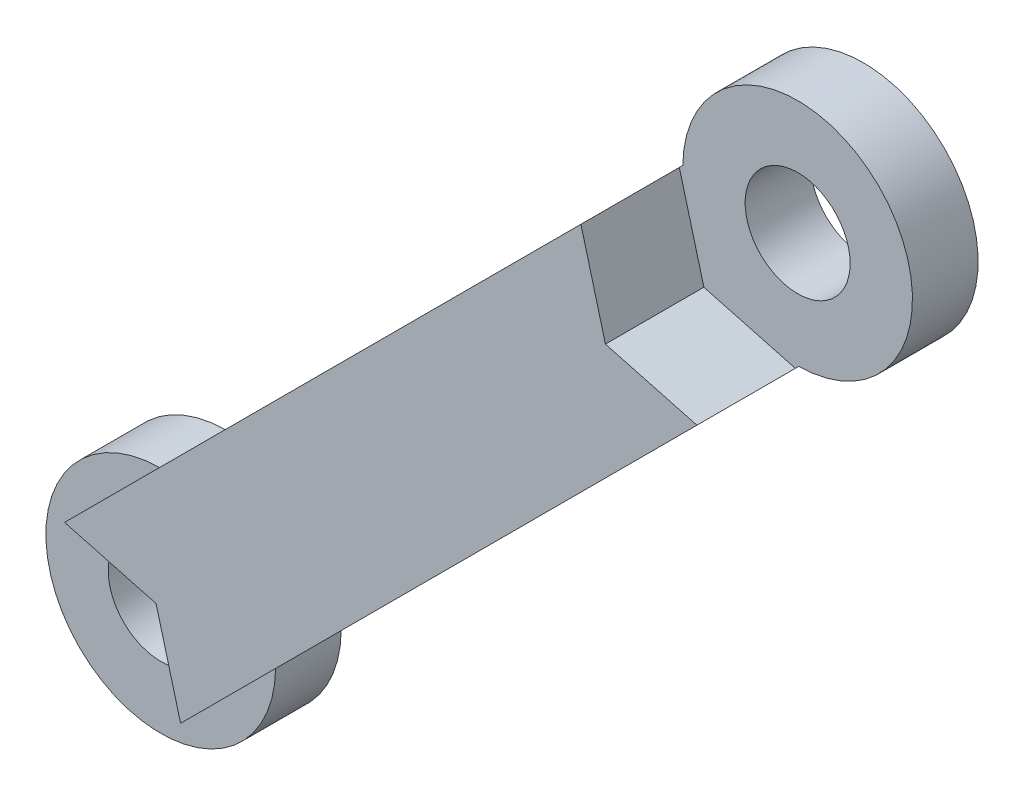
ISO-10303-21;
HEADER;
FILE_DESCRIPTION(('STEP AP214'),'2;1');
FILE_NAME('part.step','',(''),(''),'','','');
FILE_SCHEMA(('AUTOMOTIVE_DESIGN { 1 0 10303 214 1 1 1 1 }'));
ENDSEC;
DATA;
#1=APPLICATION_CONTEXT('core data for automotive mechanical design processes');
#2=APPLICATION_PROTOCOL_DEFINITION('international standard','automotive_design',2000,#1);
#3=PRODUCT_CONTEXT('',#1,'mechanical');
#4=PRODUCT('Part','Part','',(#3));
#5=PRODUCT_RELATED_PRODUCT_CATEGORY('part','',(#4));
#6=PRODUCT_DEFINITION_FORMATION('','',#4);
#7=PRODUCT_DEFINITION_CONTEXT('part definition',#1,'design');
#8=PRODUCT_DEFINITION('design','',#6,#7);
#9=PRODUCT_DEFINITION_SHAPE('','',#8);
#10=(LENGTH_UNIT() NAMED_UNIT(*) SI_UNIT(.MILLI.,.METRE.));
#11=(NAMED_UNIT(*) PLANE_ANGLE_UNIT() SI_UNIT($,.RADIAN.));
#12=(NAMED_UNIT(*) SI_UNIT($,.STERADIAN.) SOLID_ANGLE_UNIT());
#13=UNCERTAINTY_MEASURE_WITH_UNIT(LENGTH_MEASURE(1.E-05),#10,'distance_accuracy_value','');
#14=(GEOMETRIC_REPRESENTATION_CONTEXT(3) GLOBAL_UNCERTAINTY_ASSIGNED_CONTEXT((#13)) GLOBAL_UNIT_ASSIGNED_CONTEXT((#10,
#11,#12)) REPRESENTATION_CONTEXT('',''));
#15=CARTESIAN_POINT('',(0.,0.,0.));
#16=DIRECTION('',(0.,0.,1.));
#17=DIRECTION('',(1.,0.,0.));
#18=AXIS2_PLACEMENT_3D('',#15,#16,#17);
#19=CARTESIAN_POINT('',(12.0208152801712,12.0208152801714,5.));
#20=DIRECTION('',(0.,0.,-1.));
#21=DIRECTION('',(-1.,0.,0.));
#22=AXIS2_PLACEMENT_3D('',#19,#20,#21);
#23=CYLINDRICAL_SURFACE('',#22,3.5);
#24=CARTESIAN_POINT('',(12.0208152801712,12.0208152801714,2.));
#25=DIRECTION('',(0.,0.,1.));
#26=DIRECTION('',(1.,0.,0.));
#27=AXIS2_PLACEMENT_3D('',#24,#25,#26);
#28=CIRCLE('',#27,3.5);
#29=CARTESIAN_POINT('',(11.9850991347737,15.5206330407067,2.));
#30=VERTEX_POINT('',#29);
#31=CARTESIAN_POINT('',(15.5206330407065,11.9850991347739,2.));
#32=VERTEX_POINT('',#31);
#33=EDGE_CURVE('E145',#30,#32,#28,.T.);
#34=ORIENTED_EDGE('',*,*,#33,.F.);
#35=DIRECTION('',(0.,0.,-1.));
#36=VECTOR('',#35,1.);
#37=CARTESIAN_POINT('',(11.9850991347737,15.5206330407067,5.));
#38=LINE('',#37,#36);
#39=CARTESIAN_POINT('',(11.9850991347737,15.5206330407067,0.));
#40=VERTEX_POINT('',#39);
#41=EDGE_CURVE('E182',#30,#40,#38,.T.);
#42=ORIENTED_EDGE('',*,*,#41,.T.);
#43=CARTESIAN_POINT('',(12.0208152801712,12.0208152801714,0.));
#44=DIRECTION('',(0.,0.,1.));
#45=DIRECTION('',(1.,0.,0.));
#46=AXIS2_PLACEMENT_3D('',#43,#44,#45);
#47=CIRCLE('',#46,3.5);
#48=CARTESIAN_POINT('',(15.5206330407064,11.9850991347739,0.));
#49=VERTEX_POINT('',#48);
#50=EDGE_CURVE('E185',#40,#49,#47,.T.);
#51=ORIENTED_EDGE('',*,*,#50,.T.);
#52=DIRECTION('',(0.,0.,-1.));
#53=VECTOR('',#52,1.);
#54=CARTESIAN_POINT('',(15.5206330407064,11.9850991347739,5.));
#55=LINE('',#54,#53);
#56=EDGE_CURVE('E50',#32,#49,#55,.T.);
#57=ORIENTED_EDGE('',*,*,#56,.F.);
#58=EDGE_LOOP('',(#34,#42,#51,#57));
#59=FACE_BOUND('',#58,.T.);
#60=ADVANCED_FACE('F41',(#59),#23,.T.);
#61=CARTESIAN_POINT('',(31.4305356174037,31.430535617404,5.));
#62=DIRECTION('',(0.,0.,-1.));
#63=DIRECTION('',(-1.,0.,0.));
#64=AXIS2_PLACEMENT_3D('',#61,#62,#63);
#65=CYLINDRICAL_SURFACE('',#64,3.5);
#66=DIRECTION('',(0.,0.,-1.));
#67=VECTOR('',#66,1.);
#68=CARTESIAN_POINT('',(27.9307178568685,31.4662517628015,5.));
#69=LINE('',#68,#67);
#70=CARTESIAN_POINT('',(27.9307178568685,31.4662517628015,2.));
#71=VERTEX_POINT('',#70);
#72=CARTESIAN_POINT('',(27.9307178568685,31.4662517628015,0.));
#73=VERTEX_POINT('',#72);
#74=EDGE_CURVE('E200',#71,#73,#69,.T.);
#75=ORIENTED_EDGE('',*,*,#74,.F.);
#76=CARTESIAN_POINT('',(31.4305356174037,31.430535617404,2.));
#77=DIRECTION('',(0.,0.,1.));
#78=DIRECTION('',(1.,0.,0.));
#79=AXIS2_PLACEMENT_3D('',#76,#77,#78);
#80=CIRCLE('',#79,3.5);
#81=CARTESIAN_POINT('',(31.4662517628012,27.9307178568688,2.));
#82=VERTEX_POINT('',#81);
#83=EDGE_CURVE('E168',#71,#82,#80,.F.);
#84=ORIENTED_EDGE('',*,*,#83,.T.);
#85=DIRECTION('',(0.,0.,-1.));
#86=VECTOR('',#85,1.);
#87=CARTESIAN_POINT('',(31.4662517628012,27.9307178568688,5.));
#88=LINE('',#87,#86);
#89=CARTESIAN_POINT('',(31.4662517628012,27.9307178568688,0.));
#90=VERTEX_POINT('',#89);
#91=EDGE_CURVE('E202',#82,#90,#88,.T.);
#92=ORIENTED_EDGE('',*,*,#91,.T.);
#93=CARTESIAN_POINT('',(31.4305356174037,31.430535617404,0.));
#94=DIRECTION('',(0.,0.,1.));
#95=DIRECTION('',(1.,0.,0.));
#96=AXIS2_PLACEMENT_3D('',#93,#94,#95);
#97=CIRCLE('',#96,3.5);
#98=EDGE_CURVE('E191',#73,#90,#97,.F.);
#99=ORIENTED_EDGE('',*,*,#98,.F.);
#100=EDGE_LOOP('',(#75,#84,#92,#99));
#101=FACE_BOUND('',#100,.T.);
#102=ADVANCED_FACE('F220',(#101),#65,.T.);
#103=CARTESIAN_POINT('',(12.0208152801712,12.0208152801714,5.));
#104=DIRECTION('',(0.,0.,-1.));
#105=DIRECTION('',(-1.,0.,0.));
#106=AXIS2_PLACEMENT_3D('',#103,#104,#105);
#107=CYLINDRICAL_SURFACE('',#106,1.6);
#108=CARTESIAN_POINT('',(12.0208152801712,12.0208152801714,0.));
#109=DIRECTION('',(0.,0.,1.));
#110=DIRECTION('',(1.,0.,0.));
#111=AXIS2_PLACEMENT_3D('',#108,#109,#110);
#112=CIRCLE('',#111,1.6);
#113=CARTESIAN_POINT('',(13.6208152801712,12.0208152801714,0.));
#114=VERTEX_POINT('',#113);
#115=EDGE_CURVE('E174',#114,#114,#112,.T.);
#116=ORIENTED_EDGE('',*,*,#115,.F.);
#117=EDGE_LOOP('',(#116));
#118=FACE_BOUND('',#117,.T.);
#119=CARTESIAN_POINT('',(12.0208152801712,12.0208152801714,2.));
#120=DIRECTION('',(0.,0.,1.));
#121=DIRECTION('',(1.,0.,0.));
#122=AXIS2_PLACEMENT_3D('',#119,#120,#121);
#123=CIRCLE('',#122,1.6);
#124=CARTESIAN_POINT('',(13.6208152801712,12.0208152801714,2.));
#125=VERTEX_POINT('',#124);
#126=EDGE_CURVE('E138',#125,#125,#123,.F.);
#127=ORIENTED_EDGE('',*,*,#126,.F.);
#128=EDGE_LOOP('',(#127));
#129=FACE_BOUND('',#128,.T.);
#130=ADVANCED_FACE('F43',(#118,#129),#107,.F.);
#131=CARTESIAN_POINT('',(31.4305356174037,31.430535617404,5.));
#132=DIRECTION('',(0.,0.,-1.));
#133=DIRECTION('',(-1.,0.,0.));
#134=AXIS2_PLACEMENT_3D('',#131,#132,#133);
#135=CYLINDRICAL_SURFACE('',#134,1.6);
#136=CARTESIAN_POINT('',(31.4305356174037,31.430535617404,0.));
#137=DIRECTION('',(0.,0.,1.));
#138=DIRECTION('',(1.,0.,0.));
#139=AXIS2_PLACEMENT_3D('',#136,#137,#138);
#140=CIRCLE('',#139,1.6);
#141=CARTESIAN_POINT('',(33.0305356174037,31.430535617404,0.));
#142=VERTEX_POINT('',#141);
#143=EDGE_CURVE('E179',#142,#142,#140,.F.);
#144=ORIENTED_EDGE('',*,*,#143,.T.);
#145=EDGE_LOOP('',(#144));
#146=FACE_BOUND('',#145,.T.);
#147=CARTESIAN_POINT('',(31.4305356174037,31.430535617404,2.));
#148=DIRECTION('',(0.,0.,1.));
#149=DIRECTION('',(1.,0.,0.));
#150=AXIS2_PLACEMENT_3D('',#147,#148,#149);
#151=CIRCLE('',#150,1.6);
#152=CARTESIAN_POINT('',(33.0305356174037,31.430535617404,2.));
#153=VERTEX_POINT('',#152);
#154=EDGE_CURVE('E45',#153,#153,#151,.F.);
#155=ORIENTED_EDGE('',*,*,#154,.F.);
#156=EDGE_LOOP('',(#155));
#157=FACE_BOUND('',#156,.T.);
#158=ADVANCED_FACE('F254',(#146,#157),#135,.F.);
#159=CARTESIAN_POINT('',(1.76776695296628,-1.76776695296627,5.));
#160=DIRECTION('',(0.707106781186549,-0.707106781186546,0.));
#161=DIRECTION('',(0.707106781186546,0.707106781186549,0.));
#162=AXIS2_PLACEMENT_3D('',#159,#160,#161);
#163=PLANE('',#162);
#164=DIRECTION('',(0.,0.,1.));
#165=VECTOR('',#164,1.);
#166=CARTESIAN_POINT('',(15.6256995402249,12.0901656342924,2.));
#167=LINE('',#166,#165);
#168=CARTESIAN_POINT('',(15.6256995402249,12.0901656342924,2.));
#169=VERTEX_POINT('',#168);
#170=CARTESIAN_POINT('',(15.6256995402249,12.0901656342924,5.));
#171=VERTEX_POINT('',#170);
#172=EDGE_CURVE('E151',#169,#171,#167,.T.);
#173=ORIENTED_EDGE('',*,*,#172,.F.);
#174=DIRECTION('',(0.707106781186546,0.707106781186549,0.));
#175=VECTOR('',#174,1.);
#176=CARTESIAN_POINT('',(1.76776695296628,-1.76776695296627,2.));
#177=LINE('',#176,#175);
#178=EDGE_CURVE('E125',#32,#169,#177,.T.);
#179=ORIENTED_EDGE('',*,*,#178,.F.);
#180=ORIENTED_EDGE('',*,*,#56,.T.);
#181=DIRECTION('',(-0.707106781186546,-0.707106781186549,0.));
#182=VECTOR('',#181,1.);
#183=CARTESIAN_POINT('',(1.76776695296628,-1.76776695296627,0.));
#184=LINE('',#183,#182);
#185=EDGE_CURVE('E188',#90,#49,#184,.T.);
#186=ORIENTED_EDGE('',*,*,#185,.F.);
#187=ORIENTED_EDGE('',*,*,#91,.F.);
#188=DIRECTION('',(-0.707106781186546,-0.707106781186549,0.));
#189=VECTOR('',#188,1.);
#190=CARTESIAN_POINT('',(1.76776695296628,-1.76776695296627,2.));
#191=LINE('',#190,#189);
#192=CARTESIAN_POINT('',(31.3611852632827,27.8256513573503,2.));
#193=VERTEX_POINT('',#192);
#194=EDGE_CURVE('E171',#82,#193,#191,.T.);
#195=ORIENTED_EDGE('',*,*,#194,.T.);
#196=DIRECTION('',(0.,0.,-1.));
#197=VECTOR('',#196,1.);
#198=CARTESIAN_POINT('',(31.3611852632827,27.8256513573503,5.));
#199=LINE('',#198,#197);
#200=CARTESIAN_POINT('',(31.3611852632827,27.8256513573503,5.));
#201=VERTEX_POINT('',#200);
#202=EDGE_CURVE('E164',#201,#193,#199,.T.);
#203=ORIENTED_EDGE('',*,*,#202,.F.);
#204=DIRECTION('',(-0.707106781186546,-0.707106781186549,0.));
#205=VECTOR('',#204,1.);
#206=CARTESIAN_POINT('',(1.76776695296628,-1.76776695296627,5.));
#207=LINE('',#206,#205);
#208=EDGE_CURVE('E175',#201,#171,#207,.T.);
#209=ORIENTED_EDGE('',*,*,#208,.T.);
#210=EDGE_LOOP('',(#173,#179,#180,#186,#187,#195,#203,#209));
#211=FACE_BOUND('',#210,.T.);
#212=ADVANCED_FACE('F207',(#211),#163,.T.);
#213=CARTESIAN_POINT('',(-1.76776695296645,1.76776695296645,5.));
#214=DIRECTION('',(0.707106781186549,-0.707106781186546,0.));
#215=DIRECTION('',(0.707106781186546,0.707106781186549,0.));
#216=AXIS2_PLACEMENT_3D('',#213,#214,#215);
#217=PLANE('',#216);
#218=DIRECTION('',(-0.707106781186546,-0.707106781186549,0.));
#219=VECTOR('',#218,1.);
#220=CARTESIAN_POINT('',(-1.76776695296645,1.76776695296645,2.));
#221=LINE('',#220,#219);
#222=CARTESIAN_POINT('',(12.0901656342922,15.6256995402252,2.));
#223=VERTEX_POINT('',#222);
#224=EDGE_CURVE('E133',#223,#30,#221,.T.);
#225=ORIENTED_EDGE('',*,*,#224,.F.);
#226=DIRECTION('',(0.,0.,1.));
#227=VECTOR('',#226,1.);
#228=CARTESIAN_POINT('',(12.0901656342922,15.6256995402252,2.));
#229=LINE('',#228,#227);
#230=CARTESIAN_POINT('',(12.0901656342922,15.6256995402252,5.));
#231=VERTEX_POINT('',#230);
#232=EDGE_CURVE('E124',#223,#231,#229,.T.);
#233=ORIENTED_EDGE('',*,*,#232,.T.);
#234=DIRECTION('',(-0.707106781186546,-0.707106781186549,0.));
#235=VECTOR('',#234,1.);
#236=CARTESIAN_POINT('',(-1.76776695296645,1.76776695296645,5.));
#237=LINE('',#236,#235);
#238=CARTESIAN_POINT('',(27.82565135735,31.361185263283,5.));
#239=VERTEX_POINT('',#238);
#240=EDGE_CURVE('E178',#239,#231,#237,.T.);
#241=ORIENTED_EDGE('',*,*,#240,.F.);
#242=DIRECTION('',(0.,0.,-1.));
#243=VECTOR('',#242,1.);
#244=CARTESIAN_POINT('',(27.82565135735,31.361185263283,5.));
#245=LINE('',#244,#243);
#246=CARTESIAN_POINT('',(27.82565135735,31.361185263283,2.));
#247=VERTEX_POINT('',#246);
#248=EDGE_CURVE('E64',#239,#247,#245,.T.);
#249=ORIENTED_EDGE('',*,*,#248,.T.);
#250=DIRECTION('',(-0.707106781186546,-0.707106781186549,0.));
#251=VECTOR('',#250,1.);
#252=CARTESIAN_POINT('',(-1.76776695296645,1.76776695296645,2.));
#253=LINE('',#252,#251);
#254=EDGE_CURVE('E166',#71,#247,#253,.T.);
#255=ORIENTED_EDGE('',*,*,#254,.F.);
#256=ORIENTED_EDGE('',*,*,#74,.T.);
#257=DIRECTION('',(-0.707106781186546,-0.707106781186549,0.));
#258=VECTOR('',#257,1.);
#259=CARTESIAN_POINT('',(-1.76776695296645,1.76776695296645,0.));
#260=LINE('',#259,#258);
#261=EDGE_CURVE('E194',#73,#40,#260,.T.);
#262=ORIENTED_EDGE('',*,*,#261,.T.);
#263=ORIENTED_EDGE('',*,*,#41,.F.);
#264=EDGE_LOOP('',(#225,#233,#241,#249,#255,#256,#262,#263));
#265=FACE_BOUND('',#264,.T.);
#266=ADVANCED_FACE('F236',(#265),#217,.F.);
#267=CARTESIAN_POINT('',(0.,0.,5.));
#268=DIRECTION('',(0.,0.,1.));
#269=DIRECTION('',(1.,0.,0.));
#270=AXIS2_PLACEMENT_3D('',#267,#268,#269);
#271=PLANE('',#270);
#272=DIRECTION('',(-0.258819045102521,0.965925826289068,0.));
#273=VECTOR('',#272,1.);
#274=CARTESIAN_POINT('',(17.6015175555544,4.71631241457303,5.));
#275=LINE('',#274,#273);
#276=CARTESIAN_POINT('',(14.8785533134182,14.8785533134184,5.));
#277=VERTEX_POINT('',#276);
#278=EDGE_CURVE('E57',#171,#277,#275,.T.);
#279=ORIENTED_EDGE('',*,*,#278,.F.);
#280=ORIENTED_EDGE('',*,*,#208,.F.);
#281=DIRECTION('',(0.965925826289071,-0.258819045102513,0.));
#282=VECTOR('',#281,1.);
#283=CARTESIAN_POINT('',(28.5727975841567,28.572797584157,5.));
#284=LINE('',#283,#282);
#285=CARTESIAN_POINT('',(28.5727975841567,28.572797584157,5.));
#286=VERTEX_POINT('',#285);
#287=EDGE_CURVE('E149',#286,#201,#284,.T.);
#288=ORIENTED_EDGE('',*,*,#287,.F.);
#289=DIRECTION('',(0.258819045102525,-0.965925826289067,0.));
#290=VECTOR('',#289,1.);
#291=CARTESIAN_POINT('',(33.8019824706528,9.05721390558255,5.));
#292=LINE('',#291,#290);
#293=EDGE_CURVE('E11',#239,#286,#292,.T.);
#294=ORIENTED_EDGE('',*,*,#293,.F.);
#295=ORIENTED_EDGE('',*,*,#240,.T.);
#296=DIRECTION('',(-0.965925826289068,0.258819045102521,0.));
#297=VECTOR('',#296,1.);
#298=CARTESIAN_POINT('',(4.71631241457307,17.6015175555545,5.));
#299=LINE('',#298,#297);
#300=EDGE_CURVE('E141',#277,#231,#299,.T.);
#301=ORIENTED_EDGE('',*,*,#300,.F.);
#302=EDGE_LOOP('',(#279,#280,#288,#294,#295,#301));
#303=FACE_BOUND('',#302,.T.);
#304=ADVANCED_FACE('F233',(#303),#271,.T.);
#305=CARTESIAN_POINT('',(0.,0.,0.));
#306=DIRECTION('',(0.,0.,1.));
#307=DIRECTION('',(1.,0.,0.));
#308=AXIS2_PLACEMENT_3D('',#305,#306,#307);
#309=PLANE('',#308);
#310=ORIENTED_EDGE('',*,*,#115,.T.);
#311=EDGE_LOOP('',(#310));
#312=FACE_BOUND('',#311,.T.);
#313=ORIENTED_EDGE('',*,*,#50,.F.);
#314=ORIENTED_EDGE('',*,*,#261,.F.);
#315=ORIENTED_EDGE('',*,*,#98,.T.);
#316=ORIENTED_EDGE('',*,*,#185,.T.);
#317=EDGE_LOOP('',(#313,#314,#315,#316));
#318=FACE_BOUND('',#317,.T.);
#319=ORIENTED_EDGE('',*,*,#143,.F.);
#320=EDGE_LOOP('',(#319));
#321=FACE_BOUND('',#320,.T.);
#322=ADVANCED_FACE('F215',(#312,#318,#321),#309,.F.);
#323=CARTESIAN_POINT('',(0.,0.,2.));
#324=DIRECTION('',(0.,0.,1.));
#325=DIRECTION('',(1.,0.,0.));
#326=AXIS2_PLACEMENT_3D('',#323,#324,#325);
#327=PLANE('',#326);
#328=ORIENTED_EDGE('',*,*,#83,.F.);
#329=ORIENTED_EDGE('',*,*,#254,.T.);
#330=DIRECTION('',(0.258819045102525,-0.965925826289067,0.));
#331=VECTOR('',#330,1.);
#332=CARTESIAN_POINT('',(27.5267928666273,32.4765403349334,2.));
#333=LINE('',#332,#331);
#334=CARTESIAN_POINT('',(28.5727975841567,28.572797584157,2.));
#335=VERTEX_POINT('',#334);
#336=EDGE_CURVE('E157',#247,#335,#333,.T.);
#337=ORIENTED_EDGE('',*,*,#336,.T.);
#338=DIRECTION('',(0.965925826289071,-0.258819045102513,0.));
#339=VECTOR('',#338,1.);
#340=CARTESIAN_POINT('',(28.5727975841567,28.572797584157,2.));
#341=LINE('',#340,#339);
#342=EDGE_CURVE('E159',#335,#193,#341,.T.);
#343=ORIENTED_EDGE('',*,*,#342,.T.);
#344=ORIENTED_EDGE('',*,*,#194,.F.);
#345=EDGE_LOOP('',(#328,#329,#337,#343,#344));
#346=FACE_BOUND('',#345,.T.);
#347=ORIENTED_EDGE('',*,*,#154,.T.);
#348=EDGE_LOOP('',(#347));
#349=FACE_BOUND('',#348,.T.);
#350=ADVANCED_FACE('F224',(#346,#349),#327,.T.);
#351=CARTESIAN_POINT('',(27.5267928666273,32.4765403349334,2.));
#352=DIRECTION('',(-0.965925826289067,-0.258819045102525,0.));
#353=DIRECTION('',(0.258819045102525,-0.965925826289067,0.));
#354=AXIS2_PLACEMENT_3D('',#351,#352,#353);
#355=PLANE('',#354);
#356=ORIENTED_EDGE('',*,*,#293,.T.);
#357=DIRECTION('',(0.,0.,1.));
#358=VECTOR('',#357,1.);
#359=CARTESIAN_POINT('',(28.5727975841567,28.572797584157,2.));
#360=LINE('',#359,#358);
#361=EDGE_CURVE('E154',#335,#286,#360,.T.);
#362=ORIENTED_EDGE('',*,*,#361,.F.);
#363=ORIENTED_EDGE('',*,*,#336,.F.);
#364=ORIENTED_EDGE('',*,*,#248,.F.);
#365=EDGE_LOOP('',(#356,#362,#363,#364));
#366=FACE_BOUND('',#365,.T.);
#367=ADVANCED_FACE('F237',(#366),#355,.F.);
#368=CARTESIAN_POINT('',(28.5727975841567,28.572797584157,2.));
#369=DIRECTION('',(-0.258819045102513,-0.96592582628907,0.));
#370=DIRECTION('',(0.96592582628907,-0.258819045102513,0.));
#371=AXIS2_PLACEMENT_3D('',#368,#369,#370);
#372=PLANE('',#371);
#373=ORIENTED_EDGE('',*,*,#202,.T.);
#374=ORIENTED_EDGE('',*,*,#342,.F.);
#375=ORIENTED_EDGE('',*,*,#361,.T.);
#376=ORIENTED_EDGE('',*,*,#287,.T.);
#377=EDGE_LOOP('',(#373,#374,#375,#376));
#378=FACE_BOUND('',#377,.T.);
#379=ADVANCED_FACE('F230',(#378),#372,.F.);
#380=CARTESIAN_POINT('',(17.6015175555544,4.71631241457303,2.));
#381=DIRECTION('',(0.965925826289068,0.258819045102521,0.));
#382=DIRECTION('',(-0.258819045102521,0.965925826289068,0.));
#383=AXIS2_PLACEMENT_3D('',#380,#381,#382);
#384=PLANE('',#383);
#385=ORIENTED_EDGE('',*,*,#278,.T.);
#386=DIRECTION('',(0.,0.,1.));
#387=VECTOR('',#386,1.);
#388=CARTESIAN_POINT('',(14.8785533134182,14.8785533134185,2.));
#389=LINE('',#388,#387);
#390=CARTESIAN_POINT('',(14.8785533134182,14.8785533134185,2.));
#391=VERTEX_POINT('',#390);
#392=EDGE_CURVE('E116',#391,#277,#389,.T.);
#393=ORIENTED_EDGE('',*,*,#392,.F.);
#394=DIRECTION('',(-0.258819045102521,0.965925826289068,0.));
#395=VECTOR('',#394,1.);
#396=CARTESIAN_POINT('',(17.6015175555544,4.71631241457303,2.));
#397=LINE('',#396,#395);
#398=EDGE_CURVE('E120',#169,#391,#397,.T.);
#399=ORIENTED_EDGE('',*,*,#398,.F.);
#400=ORIENTED_EDGE('',*,*,#172,.T.);
#401=EDGE_LOOP('',(#385,#393,#399,#400));
#402=FACE_BOUND('',#401,.T.);
#403=ADVANCED_FACE('F118',(#402),#384,.F.);
#404=CARTESIAN_POINT('',(4.71631241457307,17.6015175555545,2.));
#405=DIRECTION('',(0.258819045102521,0.965925826289068,0.));
#406=DIRECTION('',(-0.965925826289068,0.258819045102521,0.));
#407=AXIS2_PLACEMENT_3D('',#404,#405,#406);
#408=PLANE('',#407);
#409=ORIENTED_EDGE('',*,*,#300,.T.);
#410=ORIENTED_EDGE('',*,*,#232,.F.);
#411=DIRECTION('',(-0.965925826289068,0.258819045102521,0.));
#412=VECTOR('',#411,1.);
#413=CARTESIAN_POINT('',(4.71631241457307,17.6015175555545,2.));
#414=LINE('',#413,#412);
#415=EDGE_CURVE('E128',#391,#223,#414,.T.);
#416=ORIENTED_EDGE('',*,*,#415,.F.);
#417=ORIENTED_EDGE('',*,*,#392,.T.);
#418=EDGE_LOOP('',(#409,#410,#416,#417));
#419=FACE_BOUND('',#418,.T.);
#420=ADVANCED_FACE('F129',(#419),#408,.F.);
#421=CARTESIAN_POINT('',(0.,0.,2.));
#422=DIRECTION('',(0.,0.,1.));
#423=DIRECTION('',(1.,0.,0.));
#424=AXIS2_PLACEMENT_3D('',#421,#422,#423);
#425=PLANE('',#424);
#426=ORIENTED_EDGE('',*,*,#126,.T.);
#427=EDGE_LOOP('',(#426));
#428=FACE_BOUND('',#427,.T.);
#429=ORIENTED_EDGE('',*,*,#398,.T.);
#430=ORIENTED_EDGE('',*,*,#415,.T.);
#431=ORIENTED_EDGE('',*,*,#224,.T.);
#432=ORIENTED_EDGE('',*,*,#33,.T.);
#433=ORIENTED_EDGE('',*,*,#178,.T.);
#434=EDGE_LOOP('',(#429,#430,#431,#432,#433));
#435=FACE_BOUND('',#434,.T.);
#436=ADVANCED_FACE('F135',(#428,#435),#425,.T.);
#437=CLOSED_SHELL('',(#60,#102,#130,#158,#212,#266,#304,#322,#350,#367,#379,#403,#420,#436));
#438=MANIFOLD_SOLID_BREP('B2',#437);
#439=ADVANCED_BREP_SHAPE_REPRESENTATION('',(#18,#438),#14);
#440=SHAPE_DEFINITION_REPRESENTATION(#9,#439);
ENDSEC;
END-ISO-10303-21;
